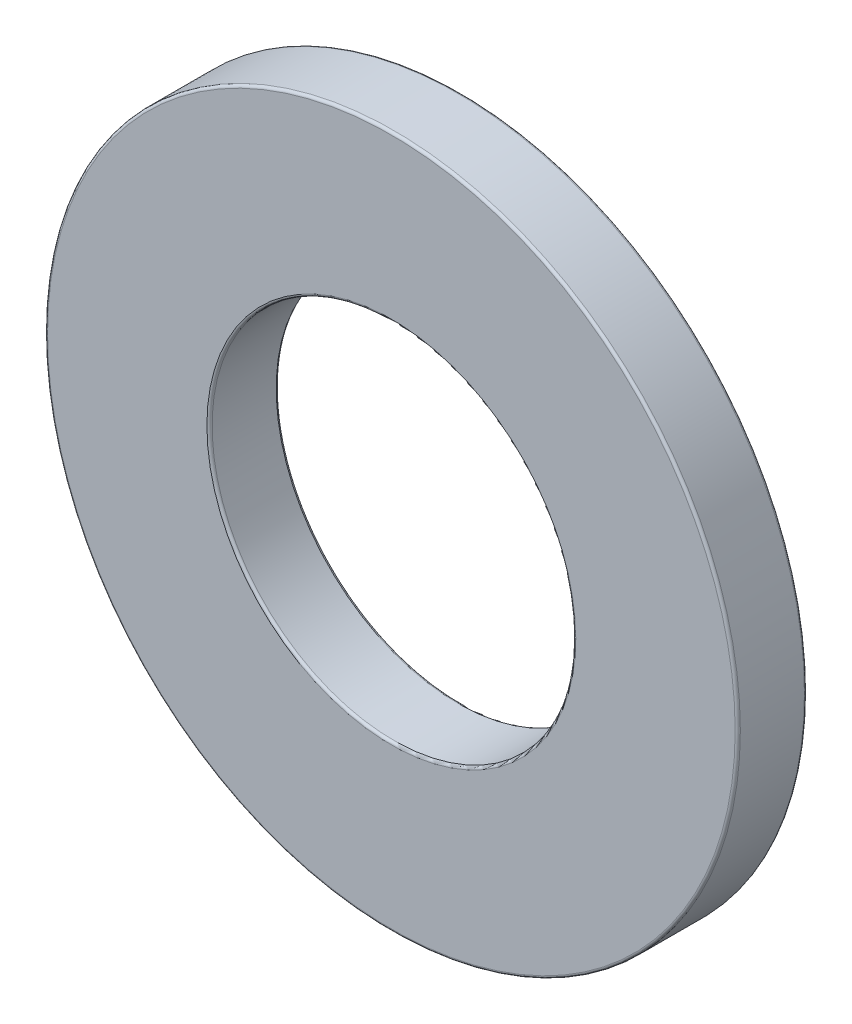
ISO-10303-21;
HEADER;
FILE_DESCRIPTION(('STEP AP214'),'2;1');
FILE_NAME('part.step','',(''),(''),'','','');
FILE_SCHEMA(('AUTOMOTIVE_DESIGN { 1 0 10303 214 1 1 1 1 }'));
ENDSEC;
DATA;
#1=APPLICATION_CONTEXT('core data for automotive mechanical design processes');
#2=APPLICATION_PROTOCOL_DEFINITION('international standard','automotive_design',2000,#1);
#3=PRODUCT_CONTEXT('',#1,'mechanical');
#4=PRODUCT('Part','Part','',(#3));
#5=PRODUCT_RELATED_PRODUCT_CATEGORY('part','',(#4));
#6=PRODUCT_DEFINITION_FORMATION('','',#4);
#7=PRODUCT_DEFINITION_CONTEXT('part definition',#1,'design');
#8=PRODUCT_DEFINITION('design','',#6,#7);
#9=PRODUCT_DEFINITION_SHAPE('','',#8);
#10=(LENGTH_UNIT() NAMED_UNIT(*) SI_UNIT(.MILLI.,.METRE.));
#11=(NAMED_UNIT(*) PLANE_ANGLE_UNIT() SI_UNIT($,.RADIAN.));
#12=(NAMED_UNIT(*) SI_UNIT($,.STERADIAN.) SOLID_ANGLE_UNIT());
#13=UNCERTAINTY_MEASURE_WITH_UNIT(LENGTH_MEASURE(1.E-05),#10,'distance_accuracy_value','');
#14=(GEOMETRIC_REPRESENTATION_CONTEXT(3) GLOBAL_UNCERTAINTY_ASSIGNED_CONTEXT((#13)) GLOBAL_UNIT_ASSIGNED_CONTEXT((#10,
#11,#12)) REPRESENTATION_CONTEXT('',''));
#15=CARTESIAN_POINT('',(0.,0.,0.));
#16=DIRECTION('',(0.,0.,1.));
#17=DIRECTION('',(1.,0.,0.));
#18=AXIS2_PLACEMENT_3D('',#15,#16,#17);
#19=CARTESIAN_POINT('',(0.,0.,-0.74));
#20=DIRECTION('',(0.,0.,1.));
#21=DIRECTION('',(1.,0.,0.));
#22=AXIS2_PLACEMENT_3D('',#19,#20,#21);
#23=TOROIDAL_SURFACE('',#22,4.26,0.06);
#24=CARTESIAN_POINT('',(0.,0.,-0.74));
#25=DIRECTION('',(0.,0.,-1.));
#26=DIRECTION('',(1.,0.,0.));
#27=AXIS2_PLACEMENT_3D('',#24,#25,#26);
#28=CIRCLE('',#27,4.2);
#29=CARTESIAN_POINT('',(4.2,0.,-0.74));
#30=VERTEX_POINT('',#29);
#31=EDGE_CURVE('E20',#30,#30,#28,.T.);
#32=ORIENTED_EDGE('',*,*,#31,.F.);
#33=EDGE_LOOP('',(#32));
#34=FACE_BOUND('',#33,.T.);
#35=CARTESIAN_POINT('',(0.,0.,-0.8));
#36=DIRECTION('',(0.,0.,1.));
#37=DIRECTION('',(1.,0.,0.));
#38=AXIS2_PLACEMENT_3D('',#35,#36,#37);
#39=CIRCLE('',#38,4.26);
#40=CARTESIAN_POINT('',(4.26,0.,-0.8));
#41=VERTEX_POINT('',#40);
#42=EDGE_CURVE('E86',#41,#41,#39,.T.);
#43=ORIENTED_EDGE('',*,*,#42,.F.);
#44=EDGE_LOOP('',(#43));
#45=FACE_BOUND('',#44,.T.);
#46=ADVANCED_FACE('F17',(#34,#45),#23,.T.);
#47=CARTESIAN_POINT('',(0.,0.,0.74));
#48=DIRECTION('',(0.,0.,1.));
#49=DIRECTION('',(1.,0.,0.));
#50=AXIS2_PLACEMENT_3D('',#47,#48,#49);
#51=TOROIDAL_SURFACE('',#50,4.26,0.06);
#52=CARTESIAN_POINT('',(0.,0.,0.8));
#53=DIRECTION('',(0.,0.,-1.));
#54=DIRECTION('',(1.,0.,0.));
#55=AXIS2_PLACEMENT_3D('',#52,#53,#54);
#56=CIRCLE('',#55,4.26);
#57=CARTESIAN_POINT('',(4.26,0.,0.8));
#58=VERTEX_POINT('',#57);
#59=EDGE_CURVE('E85',#58,#58,#56,.T.);
#60=ORIENTED_EDGE('',*,*,#59,.F.);
#61=EDGE_LOOP('',(#60));
#62=FACE_BOUND('',#61,.T.);
#63=CARTESIAN_POINT('',(0.,0.,0.74));
#64=DIRECTION('',(0.,0.,1.));
#65=DIRECTION('',(1.,0.,0.));
#66=AXIS2_PLACEMENT_3D('',#63,#64,#65);
#67=CIRCLE('',#66,4.2);
#68=CARTESIAN_POINT('',(4.2,0.,0.74));
#69=VERTEX_POINT('',#68);
#70=EDGE_CURVE('E11',#69,#69,#67,.T.);
#71=ORIENTED_EDGE('',*,*,#70,.F.);
#72=EDGE_LOOP('',(#71));
#73=FACE_BOUND('',#72,.T.);
#74=ADVANCED_FACE('F100',(#62,#73),#51,.T.);
#75=CARTESIAN_POINT('',(0.,0.,-0.74));
#76=DIRECTION('',(0.,0.,1.));
#77=DIRECTION('',(1.,0.,0.));
#78=AXIS2_PLACEMENT_3D('',#75,#76,#77);
#79=TOROIDAL_SURFACE('',#78,7.94,0.06);
#80=CARTESIAN_POINT('',(0.,0.,-0.8));
#81=DIRECTION('',(0.,0.,-1.));
#82=DIRECTION('',(1.,0.,0.));
#83=AXIS2_PLACEMENT_3D('',#80,#81,#82);
#84=CIRCLE('',#83,7.94);
#85=CARTESIAN_POINT('',(7.94,0.,-0.8));
#86=VERTEX_POINT('',#85);
#87=EDGE_CURVE('E80',#86,#86,#84,.T.);
#88=ORIENTED_EDGE('',*,*,#87,.F.);
#89=EDGE_LOOP('',(#88));
#90=FACE_BOUND('',#89,.T.);
#91=CARTESIAN_POINT('',(0.,0.,-0.74));
#92=DIRECTION('',(0.,0.,1.));
#93=DIRECTION('',(1.,0.,0.));
#94=AXIS2_PLACEMENT_3D('',#91,#92,#93);
#95=CIRCLE('',#94,8.);
#96=CARTESIAN_POINT('',(8.,0.,-0.74));
#97=VERTEX_POINT('',#96);
#98=EDGE_CURVE('E70',#97,#97,#95,.T.);
#99=ORIENTED_EDGE('',*,*,#98,.F.);
#100=EDGE_LOOP('',(#99));
#101=FACE_BOUND('',#100,.T.);
#102=ADVANCED_FACE('F107',(#90,#101),#79,.T.);
#103=CARTESIAN_POINT('',(0.,0.,0.74));
#104=DIRECTION('',(0.,0.,1.));
#105=DIRECTION('',(1.,0.,0.));
#106=AXIS2_PLACEMENT_3D('',#103,#104,#105);
#107=TOROIDAL_SURFACE('',#106,7.94,0.06);
#108=CARTESIAN_POINT('',(0.,0.,0.74));
#109=DIRECTION('',(0.,0.,-1.));
#110=DIRECTION('',(1.,0.,0.));
#111=AXIS2_PLACEMENT_3D('',#108,#109,#110);
#112=CIRCLE('',#111,8.);
#113=CARTESIAN_POINT('',(8.,0.,0.74));
#114=VERTEX_POINT('',#113);
#115=EDGE_CURVE('E74',#114,#114,#112,.T.);
#116=ORIENTED_EDGE('',*,*,#115,.F.);
#117=EDGE_LOOP('',(#116));
#118=FACE_BOUND('',#117,.T.);
#119=CARTESIAN_POINT('',(0.,0.,0.8));
#120=DIRECTION('',(0.,0.,1.));
#121=DIRECTION('',(1.,0.,0.));
#122=AXIS2_PLACEMENT_3D('',#119,#120,#121);
#123=CIRCLE('',#122,7.94);
#124=CARTESIAN_POINT('',(7.94,0.,0.8));
#125=VERTEX_POINT('',#124);
#126=EDGE_CURVE('E83',#125,#125,#123,.T.);
#127=ORIENTED_EDGE('',*,*,#126,.F.);
#128=EDGE_LOOP('',(#127));
#129=FACE_BOUND('',#128,.T.);
#130=ADVANCED_FACE('F180',(#118,#129),#107,.T.);
#131=CARTESIAN_POINT('',(0.,0.,-0.8));
#132=DIRECTION('',(0.,0.,1.));
#133=DIRECTION('',(1.,0.,0.));
#134=AXIS2_PLACEMENT_3D('',#131,#132,#133);
#135=CYLINDRICAL_SURFACE('',#134,4.2);
#136=ORIENTED_EDGE('',*,*,#70,.T.);
#137=EDGE_LOOP('',(#136));
#138=FACE_BOUND('',#137,.T.);
#139=ORIENTED_EDGE('',*,*,#31,.T.);
#140=EDGE_LOOP('',(#139));
#141=FACE_BOUND('',#140,.T.);
#142=ADVANCED_FACE('F171',(#138,#141),#135,.F.);
#143=CARTESIAN_POINT('',(0.,0.,0.8));
#144=DIRECTION('',(0.,0.,1.));
#145=DIRECTION('',(1.,0.,0.));
#146=AXIS2_PLACEMENT_3D('',#143,#144,#145);
#147=PLANE('',#146);
#148=ORIENTED_EDGE('',*,*,#59,.T.);
#149=EDGE_LOOP('',(#148));
#150=FACE_BOUND('',#149,.T.);
#151=ORIENTED_EDGE('',*,*,#126,.T.);
#152=EDGE_LOOP('',(#151));
#153=FACE_BOUND('',#152,.T.);
#154=ADVANCED_FACE('F163',(#150,#153),#147,.T.);
#155=CARTESIAN_POINT('',(0.,0.,-0.8));
#156=DIRECTION('',(0.,0.,1.));
#157=DIRECTION('',(1.,0.,0.));
#158=AXIS2_PLACEMENT_3D('',#155,#156,#157);
#159=PLANE('',#158);
#160=ORIENTED_EDGE('',*,*,#42,.T.);
#161=EDGE_LOOP('',(#160));
#162=FACE_BOUND('',#161,.T.);
#163=ORIENTED_EDGE('',*,*,#87,.T.);
#164=EDGE_LOOP('',(#163));
#165=FACE_BOUND('',#164,.T.);
#166=ADVANCED_FACE('F96',(#162,#165),#159,.F.);
#167=CARTESIAN_POINT('',(0.,0.,-0.8));
#168=DIRECTION('',(0.,0.,1.));
#169=DIRECTION('',(1.,0.,0.));
#170=AXIS2_PLACEMENT_3D('',#167,#168,#169);
#171=CYLINDRICAL_SURFACE('',#170,8.);
#172=ORIENTED_EDGE('',*,*,#115,.T.);
#173=EDGE_LOOP('',(#172));
#174=FACE_BOUND('',#173,.T.);
#175=ORIENTED_EDGE('',*,*,#98,.T.);
#176=EDGE_LOOP('',(#175));
#177=FACE_BOUND('',#176,.T.);
#178=ADVANCED_FACE('F71',(#174,#177),#171,.T.);
#179=CLOSED_SHELL('',(#46,#74,#102,#130,#142,#154,#166,#178));
#180=MANIFOLD_SOLID_BREP('B1',#179);
#181=ADVANCED_BREP_SHAPE_REPRESENTATION('',(#18,#180),#14);
#182=SHAPE_DEFINITION_REPRESENTATION(#9,#181);
ENDSEC;
END-ISO-10303-21;
